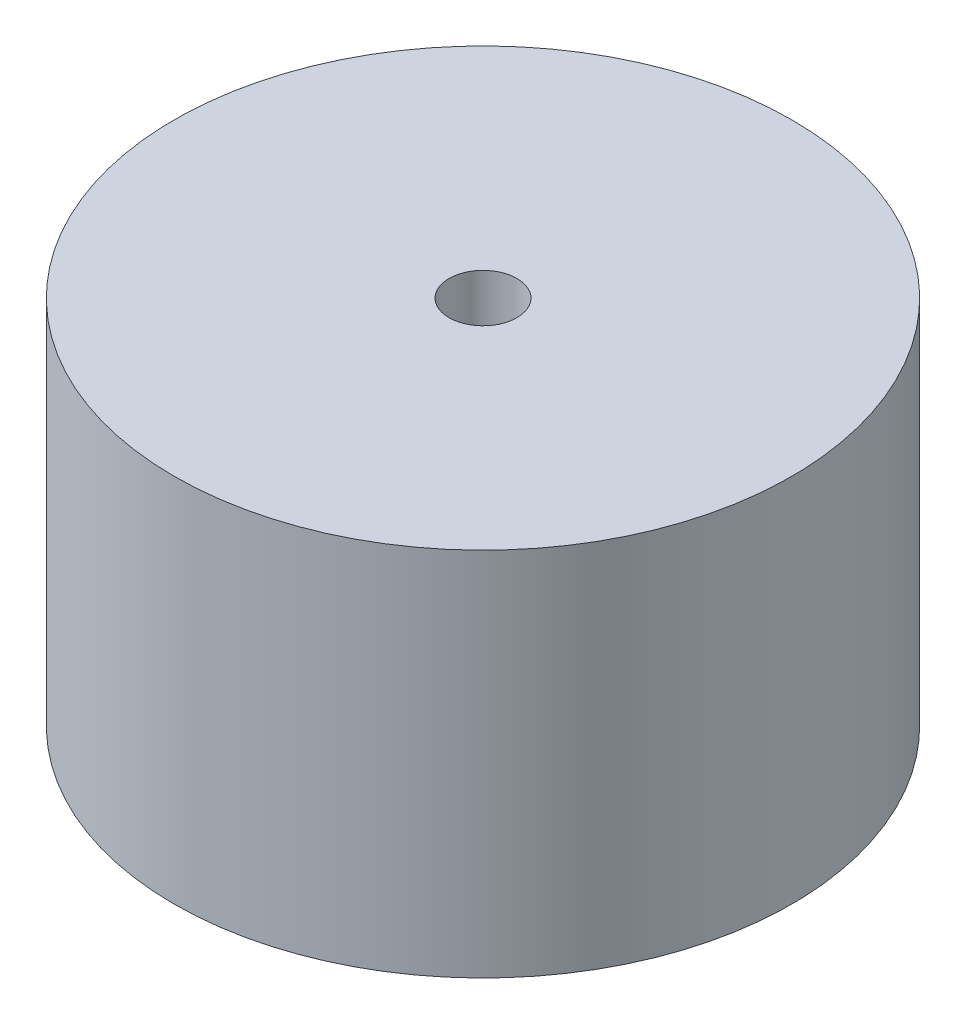
ISO-10303-21;
HEADER;
FILE_DESCRIPTION(('STEP AP214'),'2;1');
FILE_NAME('part.step','',(''),(''),'','','');
FILE_SCHEMA(('AUTOMOTIVE_DESIGN { 1 0 10303 214 1 1 1 1 }'));
ENDSEC;
DATA;
#1=APPLICATION_CONTEXT('core data for automotive mechanical design processes');
#2=APPLICATION_PROTOCOL_DEFINITION('international standard','automotive_design',2000,#1);
#3=PRODUCT_CONTEXT('',#1,'mechanical');
#4=PRODUCT('Part','Part','',(#3));
#5=PRODUCT_RELATED_PRODUCT_CATEGORY('part','',(#4));
#6=PRODUCT_DEFINITION_FORMATION('','',#4);
#7=PRODUCT_DEFINITION_CONTEXT('part definition',#1,'design');
#8=PRODUCT_DEFINITION('design','',#6,#7);
#9=PRODUCT_DEFINITION_SHAPE('','',#8);
#10=(LENGTH_UNIT() NAMED_UNIT(*) SI_UNIT(.MILLI.,.METRE.));
#11=(NAMED_UNIT(*) PLANE_ANGLE_UNIT() SI_UNIT($,.RADIAN.));
#12=(NAMED_UNIT(*) SI_UNIT($,.STERADIAN.) SOLID_ANGLE_UNIT());
#13=UNCERTAINTY_MEASURE_WITH_UNIT(LENGTH_MEASURE(1.E-05),#10,'distance_accuracy_value','');
#14=(GEOMETRIC_REPRESENTATION_CONTEXT(3) GLOBAL_UNCERTAINTY_ASSIGNED_CONTEXT((#13)) GLOBAL_UNIT_ASSIGNED_CONTEXT((#10,
#11,#12)) REPRESENTATION_CONTEXT('',''));
#15=CARTESIAN_POINT('',(0.,0.,0.));
#16=DIRECTION('',(0.,0.,1.));
#17=DIRECTION('',(1.,0.,0.));
#18=AXIS2_PLACEMENT_3D('',#15,#16,#17);
#19=CARTESIAN_POINT('',(0.,60.,0.));
#20=DIRECTION('',(0.,-1.,0.));
#21=DIRECTION('',(0.,0.,-1.));
#22=AXIS2_PLACEMENT_3D('',#19,#20,#21);
#23=CYLINDRICAL_SURFACE('',#22,50.);
#24=CARTESIAN_POINT('',(0.,60.,0.));
#25=DIRECTION('',(0.,1.,0.));
#26=DIRECTION('',(0.,0.,1.));
#27=AXIS2_PLACEMENT_3D('',#24,#25,#26);
#28=CIRCLE('',#27,50.);
#29=CARTESIAN_POINT('',(0.,60.,50.));
#30=VERTEX_POINT('',#29);
#31=EDGE_CURVE('E10',#30,#30,#28,.T.);
#32=ORIENTED_EDGE('',*,*,#31,.F.);
#33=EDGE_LOOP('',(#32));
#34=FACE_BOUND('',#33,.T.);
#35=CARTESIAN_POINT('',(0.,0.,0.));
#36=DIRECTION('',(0.,1.,0.));
#37=DIRECTION('',(0.,0.,1.));
#38=AXIS2_PLACEMENT_3D('',#35,#36,#37);
#39=CIRCLE('',#38,50.);
#40=CARTESIAN_POINT('',(0.,0.,50.));
#41=VERTEX_POINT('',#40);
#42=EDGE_CURVE('E18',#41,#41,#39,.T.);
#43=ORIENTED_EDGE('',*,*,#42,.T.);
#44=EDGE_LOOP('',(#43));
#45=FACE_BOUND('',#44,.T.);
#46=ADVANCED_FACE('F15',(#34,#45),#23,.T.);
#47=CARTESIAN_POINT('',(0.,60.,0.));
#48=DIRECTION('',(0.,1.,0.));
#49=DIRECTION('',(0.,0.,1.));
#50=AXIS2_PLACEMENT_3D('',#47,#48,#49);
#51=PLANE('',#50);
#52=CARTESIAN_POINT('',(0.,60.,0.));
#53=DIRECTION('',(0.,1.,0.));
#54=DIRECTION('',(0.,0.,1.));
#55=AXIS2_PLACEMENT_3D('',#52,#53,#54);
#56=CIRCLE('',#55,5.5);
#57=CARTESIAN_POINT('',(0.,60.,5.5));
#58=VERTEX_POINT('',#57);
#59=EDGE_CURVE('E29',#58,#58,#56,.T.);
#60=ORIENTED_EDGE('',*,*,#59,.F.);
#61=EDGE_LOOP('',(#60));
#62=FACE_BOUND('',#61,.T.);
#63=ORIENTED_EDGE('',*,*,#31,.T.);
#64=EDGE_LOOP('',(#63));
#65=FACE_BOUND('',#64,.T.);
#66=ADVANCED_FACE('F35',(#62,#65),#51,.T.);
#67=CARTESIAN_POINT('',(0.,0.,0.));
#68=DIRECTION('',(0.,1.,0.));
#69=DIRECTION('',(0.,0.,1.));
#70=AXIS2_PLACEMENT_3D('',#67,#68,#69);
#71=PLANE('',#70);
#72=CARTESIAN_POINT('',(0.,0.,0.));
#73=DIRECTION('',(0.,1.,0.));
#74=DIRECTION('',(0.,0.,1.));
#75=AXIS2_PLACEMENT_3D('',#72,#73,#74);
#76=CIRCLE('',#75,5.5);
#77=CARTESIAN_POINT('',(0.,0.,5.5));
#78=VERTEX_POINT('',#77);
#79=EDGE_CURVE('E25',#78,#78,#76,.T.);
#80=ORIENTED_EDGE('',*,*,#79,.T.);
#81=EDGE_LOOP('',(#80));
#82=FACE_BOUND('',#81,.T.);
#83=ORIENTED_EDGE('',*,*,#42,.F.);
#84=EDGE_LOOP('',(#83));
#85=FACE_BOUND('',#84,.T.);
#86=ADVANCED_FACE('F37',(#82,#85),#71,.F.);
#87=CARTESIAN_POINT('',(0.,60.,0.));
#88=DIRECTION('',(0.,1.,0.));
#89=DIRECTION('',(0.,0.,1.));
#90=AXIS2_PLACEMENT_3D('',#87,#88,#89);
#91=CYLINDRICAL_SURFACE('',#90,5.5);
#92=ORIENTED_EDGE('',*,*,#79,.F.);
#93=EDGE_LOOP('',(#92));
#94=FACE_BOUND('',#93,.T.);
#95=ORIENTED_EDGE('',*,*,#59,.T.);
#96=EDGE_LOOP('',(#95));
#97=FACE_BOUND('',#96,.T.);
#98=ADVANCED_FACE('F33',(#94,#97),#91,.F.);
#99=CLOSED_SHELL('',(#46,#66,#86,#98));
#100=MANIFOLD_SOLID_BREP('B1',#99);
#101=ADVANCED_BREP_SHAPE_REPRESENTATION('',(#18,#100),#14);
#102=SHAPE_DEFINITION_REPRESENTATION(#9,#101);
ENDSEC;
END-ISO-10303-21;
